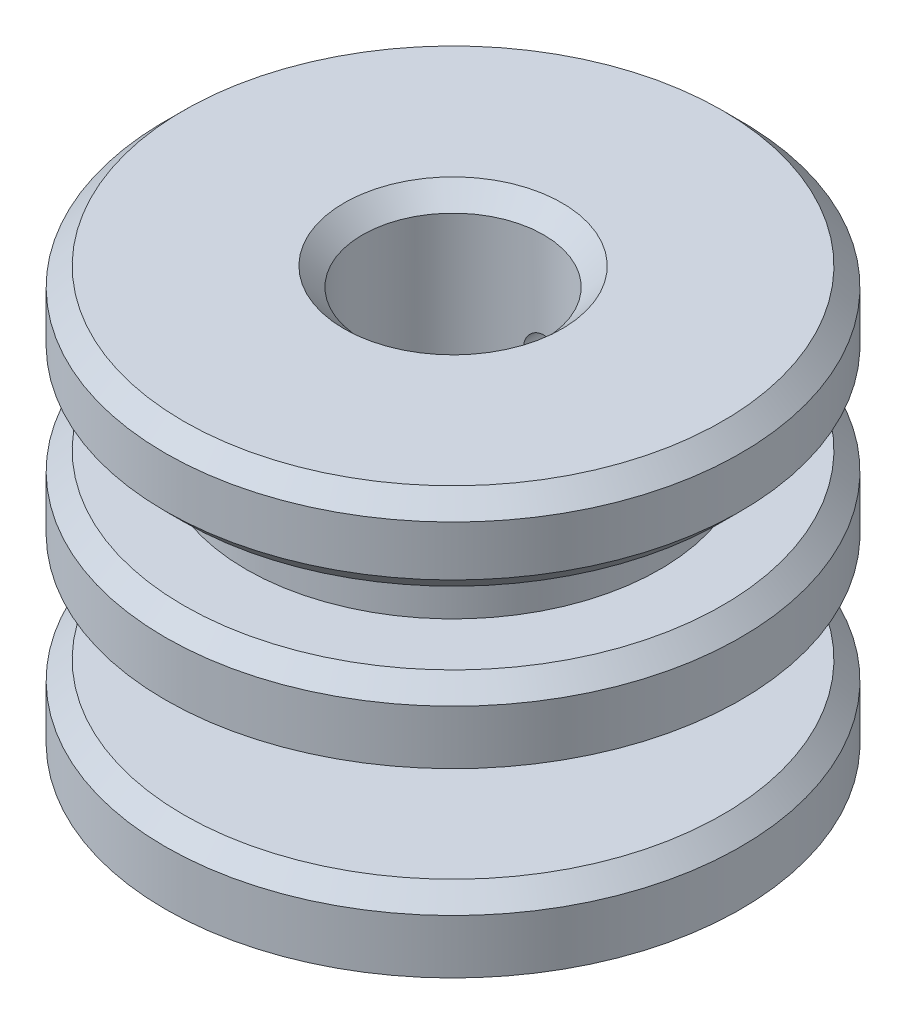
ISO-10303-21;
HEADER;
FILE_DESCRIPTION(('STEP AP214'),'2;1');
FILE_NAME('part.step','',(''),(''),'','','');
FILE_SCHEMA(('AUTOMOTIVE_DESIGN { 1 0 10303 214 1 1 1 1 }'));
ENDSEC;
DATA;
#1=APPLICATION_CONTEXT('core data for automotive mechanical design processes');
#2=APPLICATION_PROTOCOL_DEFINITION('international standard','automotive_design',2000,#1);
#3=PRODUCT_CONTEXT('',#1,'mechanical');
#4=PRODUCT('Part','Part','',(#3));
#5=PRODUCT_RELATED_PRODUCT_CATEGORY('part','',(#4));
#6=PRODUCT_DEFINITION_FORMATION('','',#4);
#7=PRODUCT_DEFINITION_CONTEXT('part definition',#1,'design');
#8=PRODUCT_DEFINITION('design','',#6,#7);
#9=PRODUCT_DEFINITION_SHAPE('','',#8);
#10=(LENGTH_UNIT() NAMED_UNIT(*) SI_UNIT(.MILLI.,.METRE.));
#11=(NAMED_UNIT(*) PLANE_ANGLE_UNIT() SI_UNIT($,.RADIAN.));
#12=(NAMED_UNIT(*) SI_UNIT($,.STERADIAN.) SOLID_ANGLE_UNIT());
#13=UNCERTAINTY_MEASURE_WITH_UNIT(LENGTH_MEASURE(1.E-05),#10,'distance_accuracy_value','');
#14=(GEOMETRIC_REPRESENTATION_CONTEXT(3) GLOBAL_UNCERTAINTY_ASSIGNED_CONTEXT((#13)) GLOBAL_UNIT_ASSIGNED_CONTEXT((#10,
#11,#12)) REPRESENTATION_CONTEXT('',''));
#15=CARTESIAN_POINT('',(0.,0.,0.));
#16=DIRECTION('',(0.,0.,1.));
#17=DIRECTION('',(1.,0.,0.));
#18=AXIS2_PLACEMENT_3D('',#15,#16,#17);
#19=CARTESIAN_POINT('',(0.,3.5,0.));
#20=DIRECTION('',(0.,1.,0.));
#21=DIRECTION('',(0.,0.,1.));
#22=AXIS2_PLACEMENT_3D('',#19,#20,#21);
#23=PLANE('',#22);
#24=CARTESIAN_POINT('',(0.,3.5,0.));
#25=DIRECTION('',(0.,1.,0.));
#26=DIRECTION('',(0.,0.,1.));
#27=AXIS2_PLACEMENT_3D('',#24,#25,#26);
#28=CIRCLE('',#27,1.1375);
#29=CARTESIAN_POINT('',(0.,3.5,1.1375));
#30=VERTEX_POINT('',#29);
#31=EDGE_CURVE('E162',#30,#30,#28,.T.);
#32=ORIENTED_EDGE('',*,*,#31,.F.);
#33=EDGE_LOOP('',(#32));
#34=FACE_BOUND('',#33,.T.);
#35=CARTESIAN_POINT('',(0.,3.5,0.));
#36=DIRECTION('',(0.,1.,0.));
#37=DIRECTION('',(0.,0.,1.));
#38=AXIS2_PLACEMENT_3D('',#35,#36,#37);
#39=CIRCLE('',#38,2.5);
#40=CARTESIAN_POINT('',(0.,3.5,-2.5));
#41=VERTEX_POINT('',#40);
#42=EDGE_CURVE('E192',#41,#41,#39,.F.);
#43=ORIENTED_EDGE('',*,*,#42,.F.);
#44=EDGE_LOOP('',(#43));
#45=FACE_BOUND('',#44,.T.);
#46=ADVANCED_FACE('F39',(#34,#45),#23,.T.);
#47=CARTESIAN_POINT('',(0.,2.,0.));
#48=DIRECTION('',(0.,1.,0.));
#49=DIRECTION('',(0.,0.,1.));
#50=AXIS2_PLACEMENT_3D('',#47,#48,#49);
#51=PLANE('',#50);
#52=CARTESIAN_POINT('',(0.,2.,0.));
#53=DIRECTION('',(0.,1.,0.));
#54=DIRECTION('',(0.,0.,1.));
#55=AXIS2_PLACEMENT_3D('',#52,#53,#54);
#56=CIRCLE('',#55,7.4295);
#57=CARTESIAN_POINT('',(0.,2.,7.4295));
#58=VERTEX_POINT('',#57);
#59=EDGE_CURVE('E81',#58,#58,#56,.T.);
#60=ORIENTED_EDGE('',*,*,#59,.T.);
#61=EDGE_LOOP('',(#60));
#62=FACE_BOUND('',#61,.T.);
#63=CARTESIAN_POINT('',(0.,2.,0.));
#64=DIRECTION('',(0.,1.,0.));
#65=DIRECTION('',(0.,0.,1.));
#66=AXIS2_PLACEMENT_3D('',#63,#64,#65);
#67=CIRCLE('',#66,3.3707324);
#68=CARTESIAN_POINT('',(0.,2.,3.3707324));
#69=VERTEX_POINT('',#68);
#70=EDGE_CURVE('E172',#69,#69,#67,.T.);
#71=ORIENTED_EDGE('',*,*,#70,.F.);
#72=EDGE_LOOP('',(#71));
#73=FACE_BOUND('',#72,.T.);
#74=ADVANCED_FACE('F117',(#62,#73),#51,.T.);
#75=CARTESIAN_POINT('',(0.,0.,0.));
#76=DIRECTION('',(0.,1.,0.));
#77=DIRECTION('',(0.,0.,1.));
#78=AXIS2_PLACEMENT_3D('',#75,#76,#77);
#79=PLANE('',#78);
#80=CARTESIAN_POINT('',(0.,0.,0.));
#81=DIRECTION('',(0.,1.,0.));
#82=DIRECTION('',(0.,0.,1.));
#83=AXIS2_PLACEMENT_3D('',#80,#81,#82);
#84=CIRCLE('',#83,7.9375);
#85=CARTESIAN_POINT('',(0.,0.,7.9375));
#86=VERTEX_POINT('',#85);
#87=EDGE_CURVE('E189',#86,#86,#84,.T.);
#88=ORIENTED_EDGE('',*,*,#87,.F.);
#89=EDGE_LOOP('',(#88));
#90=FACE_BOUND('',#89,.T.);
#91=CARTESIAN_POINT('',(0.,0.,0.));
#92=DIRECTION('',(0.,1.,0.));
#93=DIRECTION('',(0.,0.,1.));
#94=AXIS2_PLACEMENT_3D('',#91,#92,#93);
#95=CIRCLE('',#94,2.38125);
#96=CARTESIAN_POINT('',(0.,0.,2.38125));
#97=VERTEX_POINT('',#96);
#98=EDGE_CURVE('E185',#97,#97,#95,.T.);
#99=ORIENTED_EDGE('',*,*,#98,.T.);
#100=EDGE_LOOP('',(#99));
#101=FACE_BOUND('',#100,.T.);
#102=ADVANCED_FACE('F120',(#90,#101),#79,.F.);
#103=CARTESIAN_POINT('',(0.,2.,0.));
#104=DIRECTION('',(0.,-1.,0.));
#105=DIRECTION('',(0.,0.,-1.));
#106=AXIS2_PLACEMENT_3D('',#103,#104,#105);
#107=CYLINDRICAL_SURFACE('',#106,7.9375);
#108=CARTESIAN_POINT('',(0.,1.492,0.));
#109=DIRECTION('',(0.,1.,0.));
#110=DIRECTION('',(0.,0.,1.));
#111=AXIS2_PLACEMENT_3D('',#108,#109,#110);
#112=CIRCLE('',#111,7.9375);
#113=CARTESIAN_POINT('',(0.,1.492,7.9375));
#114=VERTEX_POINT('',#113);
#115=EDGE_CURVE('E202',#114,#114,#112,.F.);
#116=ORIENTED_EDGE('',*,*,#115,.T.);
#117=EDGE_LOOP('',(#116));
#118=FACE_BOUND('',#117,.T.);
#119=ORIENTED_EDGE('',*,*,#87,.T.);
#120=EDGE_LOOP('',(#119));
#121=FACE_BOUND('',#120,.T.);
#122=ADVANCED_FACE('F115',(#118,#121),#107,.T.);
#123=CARTESIAN_POINT('',(0.,2.,0.));
#124=DIRECTION('',(0.,-1.,0.));
#125=DIRECTION('',(0.,0.,-1.));
#126=AXIS2_PLACEMENT_3D('',#123,#124,#125);
#127=CYLINDRICAL_SURFACE('',#126,2.38125);
#128=CARTESIAN_POINT('',(0.,2.,0.));
#129=DIRECTION('',(0.,1.,0.));
#130=DIRECTION('',(0.,0.,1.));
#131=AXIS2_PLACEMENT_3D('',#128,#129,#130);
#132=CIRCLE('',#131,2.38125);
#133=CARTESIAN_POINT('',(0.,2.,2.38125));
#134=VERTEX_POINT('',#133);
#135=EDGE_CURVE('E181',#134,#134,#132,.T.);
#136=ORIENTED_EDGE('',*,*,#135,.T.);
#137=EDGE_LOOP('',(#136));
#138=FACE_BOUND('',#137,.T.);
#139=ORIENTED_EDGE('',*,*,#98,.F.);
#140=EDGE_LOOP('',(#139));
#141=FACE_BOUND('',#140,.T.);
#142=ADVANCED_FACE('F112',(#138,#141),#127,.F.);
#143=CARTESIAN_POINT('',(0.,2.,0.));
#144=DIRECTION('',(0.,1.,0.));
#145=DIRECTION('',(0.,0.,1.));
#146=AXIS2_PLACEMENT_3D('',#143,#144,#145);
#147=PLANE('',#146);
#148=CARTESIAN_POINT('',(0.,2.,0.));
#149=DIRECTION('',(0.,1.,0.));
#150=DIRECTION('',(0.,0.,1.));
#151=AXIS2_PLACEMENT_3D('',#148,#149,#150);
#152=CIRCLE('',#151,1.1375);
#153=CARTESIAN_POINT('',(0.,2.,1.1375));
#154=VERTEX_POINT('',#153);
#155=EDGE_CURVE('E165',#154,#154,#152,.T.);
#156=ORIENTED_EDGE('',*,*,#155,.T.);
#157=EDGE_LOOP('',(#156));
#158=FACE_BOUND('',#157,.T.);
#159=ORIENTED_EDGE('',*,*,#135,.F.);
#160=EDGE_LOOP('',(#159));
#161=FACE_BOUND('',#160,.T.);
#162=ADVANCED_FACE('F109',(#158,#161),#147,.F.);
#163=CARTESIAN_POINT('',(0.,3.5,0.));
#164=DIRECTION('',(0.,-1.,0.));
#165=DIRECTION('',(0.,0.,-1.));
#166=AXIS2_PLACEMENT_3D('',#163,#164,#165);
#167=CYLINDRICAL_SURFACE('',#166,3.3707324);
#168=CARTESIAN_POINT('',(0.,4.5,-3.3707324));
#169=CARTESIAN_POINT('',(-0.027920858534992,4.49999884581119,-3.37073195597288));
#170=CARTESIAN_POINT('',(-0.0558580082287975,4.4976533822732,-3.37038184613021));
#171=CARTESIAN_POINT('',(-0.110951674200742,4.48833573130278,-3.36901888267828));
#172=CARTESIAN_POINT('',(-0.138107399249805,4.48135901537788,-3.36800538040973));
#173=CARTESIAN_POINT('',(-0.190832907339295,4.46299170098424,-3.36542954720662));
#174=CARTESIAN_POINT('',(-0.216403863038884,4.45160441249328,-3.36386762792149));
#175=CARTESIAN_POINT('',(-0.265268022204005,4.42474722636508,-3.3603676330121));
#176=CARTESIAN_POINT('',(-0.288561546690961,4.40927790526206,-3.35842961051777));
#177=CARTESIAN_POINT('',(-0.332391713755101,4.37456970999245,-3.35437641462116));
#178=CARTESIAN_POINT('',(-0.352908419705849,4.35530578767948,-3.35226012068015));
#179=CARTESIAN_POINT('',(-0.390430567523994,4.31360911727493,-3.34809769069515));
#180=CARTESIAN_POINT('',(-0.407435809182262,4.29117618862251,-3.34605155865703));
#181=CARTESIAN_POINT('',(-0.437529691906431,4.2436446406349,-3.34225024114205));
#182=CARTESIAN_POINT('',(-0.450599085650153,4.2185337093089,-3.34049650360256));
#183=CARTESIAN_POINT('',(-0.472327285075649,4.1664428019623,-3.33749380523005));
#184=CARTESIAN_POINT('',(-0.480986325794444,4.13946292562878,-3.33624481749858));
#185=CARTESIAN_POINT('',(-0.493586195514157,4.08460948142785,-3.33440402998209));
#186=CARTESIAN_POINT('',(-0.497561125654794,4.05674390883326,-3.33380748263638));
#187=CARTESIAN_POINT('',(-0.500785574016822,4.00073536799169,-3.33332469835715));
#188=CARTESIAN_POINT('',(-0.500035357653317,3.97259241541401,-3.33343842152719));
#189=CARTESIAN_POINT('',(-0.493858685873958,3.91706864998727,-3.33435898735029));
#190=CARTESIAN_POINT('',(-0.488470180561042,3.88968350874145,-3.33516020481374));
#191=CARTESIAN_POINT('',(-0.473229283751064,3.83621041627017,-3.33735669596831));
#192=CARTESIAN_POINT('',(-0.463376768528197,3.81012250102124,-3.33875198612485));
#193=CARTESIAN_POINT('',(-0.439447963415574,3.75986876054762,-3.34198563403982));
#194=CARTESIAN_POINT('',(-0.425355568974366,3.73571071645752,-3.34382567578635));
#195=CARTESIAN_POINT('',(-0.393358509658937,3.6900878750967,-3.34774027752663));
#196=CARTESIAN_POINT('',(-0.375453600018527,3.66862325088614,-3.34981485257357));
#197=CARTESIAN_POINT('',(-0.336131306519958,3.62877658274773,-3.35398963365019));
#198=CARTESIAN_POINT('',(-0.31468128837668,3.61042673382278,-3.35608989194537));
#199=CARTESIAN_POINT('',(-0.268988972981071,3.57758248666879,-3.3600605438281));
#200=CARTESIAN_POINT('',(-0.2447466639849,3.56308810465597,-3.36193093644881));
#201=CARTESIAN_POINT('',(-0.194130232363579,3.53836469567626,-3.36523300676029));
#202=CARTESIAN_POINT('',(-0.167754895436238,3.52813811900734,-3.36666443229983));
#203=CARTESIAN_POINT('',(-0.113635239691182,3.51226842964512,-3.36892516636892));
#204=CARTESIAN_POINT('',(-0.0858910114901812,3.50662501399023,-3.36975451469732));
#205=CARTESIAN_POINT('',(-0.030099032282589,3.5001245751329,-3.37071238529574));
#206=CARTESIAN_POINT('',(-0.00205654618325971,3.49922328398923,-3.37084738903507));
#207=CARTESIAN_POINT('',(0.0537791618329003,3.50211522629928,-3.37041899204438));
#208=CARTESIAN_POINT('',(0.0815723912654967,3.505908317722,-3.36985561244432));
#209=CARTESIAN_POINT('',(0.135986799410733,3.51804454453046,-3.36809776078749));
#210=CARTESIAN_POINT('',(0.162612885716383,3.52636614590635,-3.36690627633272));
#211=CARTESIAN_POINT('',(0.214091897523264,3.54730048737677,-3.36402539440444));
#212=CARTESIAN_POINT('',(0.238944741285117,3.55991342513031,-3.36233597399647));
#213=CARTESIAN_POINT('',(0.286366663409767,3.58917649305886,-3.35863089223554));
#214=CARTESIAN_POINT('',(0.308918210899693,3.60585474408651,-3.35661299248112));
#215=CARTESIAN_POINT('',(0.35091801190852,3.64273580755681,-3.35248261044069));
#216=CARTESIAN_POINT('',(0.370366089140317,3.66293882008091,-3.35037012279051));
#217=CARTESIAN_POINT('',(0.405767678097176,3.70649284454076,-3.34626814278441));
#218=CARTESIAN_POINT('',(0.42169153834585,3.72986808120506,-3.34427978815961));
#219=CARTESIAN_POINT('',(0.449386660171263,3.7789875692684,-3.34067125298515));
#220=CARTESIAN_POINT('',(0.461158031987257,3.80473175775419,-3.33905106266197));
#221=CARTESIAN_POINT('',(0.480167926607531,3.8577694278684,-3.33637050349637));
#222=CARTESIAN_POINT('',(0.48742213312231,3.88505718600507,-3.33530819969366));
#223=CARTESIAN_POINT('',(0.497241739005651,3.94048061481776,-3.3338585181474));
#224=CARTESIAN_POINT('',(0.499807454411648,3.96861622821237,-3.33347109491222));
#225=CARTESIAN_POINT('',(0.500169851780815,4.02464119891652,-3.3334167126355));
#226=CARTESIAN_POINT('',(0.498013152556583,4.05253025904644,-3.33374271081059));
#227=CARTESIAN_POINT('',(0.489091758107744,4.10754439648219,-3.33506314529619));
#228=CARTESIAN_POINT('',(0.482327069624303,4.13466947490562,-3.33605758062882));
#229=CARTESIAN_POINT('',(0.464398072745269,4.18737323204891,-3.33860039977759));
#230=CARTESIAN_POINT('',(0.453236950833954,4.21295301532815,-3.34014838231436));
#231=CARTESIAN_POINT('',(0.426836541409066,4.26188448135575,-3.34362437705717));
#232=CARTESIAN_POINT('',(0.411597121962114,4.28523609198931,-3.34555240155709));
#233=CARTESIAN_POINT('',(0.377303068422935,4.32928531369934,-3.3495939112395));
#234=CARTESIAN_POINT('',(0.358213888368723,4.34995588797208,-3.35170897063949));
#235=CARTESIAN_POINT('',(0.316835172516294,4.38781695335703,-3.3558730388943));
#236=CARTESIAN_POINT('',(0.294544893231012,4.40500663375553,-3.35792203226889));
#237=CARTESIAN_POINT('',(0.247255921759422,4.43550029781356,-3.36173566270468));
#238=CARTESIAN_POINT('',(0.222243312560219,4.44878289383489,-3.36349871174772));
#239=CARTESIAN_POINT('',(0.170327989967962,4.47093868089317,-3.36652620856215));
#240=CARTESIAN_POINT('',(0.143427274507468,4.47981645501002,-3.36779117428956));
#241=CARTESIAN_POINT('',(0.0970037631650437,4.49088851747963,-3.36939005661064));
#242=CARTESIAN_POINT('',(0.077768002074295,4.49430012430813,-3.36989085976448));
#243=CARTESIAN_POINT('',(0.0390241449266384,4.49885625532159,-3.37056218465701));
#244=CARTESIAN_POINT('',(0.0195160521454493,4.50000080675202,-3.37073271036497));
#245=CARTESIAN_POINT('',(0.,4.5,-3.3707324));
#246=B_SPLINE_CURVE_WITH_KNOTS('',3,(#168,#169,#170,#171,#172,#173,#174,#175,#176,#177,#178,
#179,#180,#181,#182,#183,#184,#185,#186,#187,#188,#189,#190,#191,#192,#193,#194,#195,#196,#197,
#198,#199,#200,#201,#202,#203,#204,#205,#206,#207,#208,#209,#210,#211,#212,#213,#214,#215,#216,
#217,#218,#219,#220,#221,#222,#223,#224,#225,#226,#227,#228,#229,#230,#231,#232,#233,#234,#235,
#236,#237,#238,#239,#240,#241,#242,#243,#244,#245),.UNSPECIFIED.,.T.,.F.,(4,2,2,2,2,2,2,2,2,2,2,
2,2,2,2,2,2,2,2,2,2,2,2,2,2,2,2,2,2,2,2,2,2,2,2,2,2,2,4),(0.,0.0836912638754877,
0.16746448282372,0.251174954384891,0.334873609248749,0.419144484030289,0.503420162261685,
0.588101517115428,0.672778358648735,0.7568348529606,0.840886625796777,0.924257160754208,
1.00763000657514,1.09132361791786,1.17502260407095,1.25954003034908,1.34405781210426,
1.42862405196998,1.51318470128194,1.59695455436652,1.68072187301216,1.76409429766159,
1.84747056296623,1.93144080116889,2.01541580745489,2.1000725432916,2.18472703151263,
2.26908593398137,2.35343914985412,2.43696340357937,2.52048753511476,2.60395124038317,
2.68741764603817,2.7716693336959,2.85594062138737,2.94066497899636,3.02530099771829,
3.0838000119048,3.14229832304612),.UNSPECIFIED.);
#247=CARTESIAN_POINT('',(0.,4.5,-3.3707324));
#248=VERTEX_POINT('',#247);
#249=EDGE_CURVE('E57',#248,#248,#246,.T.);
#250=ORIENTED_EDGE('',*,*,#249,.T.);
#251=EDGE_LOOP('',(#250));
#252=FACE_BOUND('',#251,.T.);
#253=ORIENTED_EDGE('',*,*,#70,.T.);
#254=EDGE_LOOP('',(#253));
#255=FACE_BOUND('',#254,.T.);
#256=CARTESIAN_POINT('',(0.,5.,0.));
#257=DIRECTION('',(0.,1.,0.));
#258=DIRECTION('',(0.,0.,1.));
#259=AXIS2_PLACEMENT_3D('',#256,#257,#258);
#260=CIRCLE('',#259,3.3707324);
#261=CARTESIAN_POINT('',(0.,5.,3.3707324));
#262=VERTEX_POINT('',#261);
#263=EDGE_CURVE('E168',#262,#262,#260,.T.);
#264=ORIENTED_EDGE('',*,*,#263,.F.);
#265=EDGE_LOOP('',(#264));
#266=FACE_BOUND('',#265,.T.);
#267=ADVANCED_FACE('F103',(#252,#255,#266),#167,.T.);
#268=CARTESIAN_POINT('',(0.,3.5,0.));
#269=DIRECTION('',(0.,-1.,0.));
#270=DIRECTION('',(0.,0.,-1.));
#271=AXIS2_PLACEMENT_3D('',#268,#269,#270);
#272=CYLINDRICAL_SURFACE('',#271,1.1375);
#273=ORIENTED_EDGE('',*,*,#31,.T.);
#274=EDGE_LOOP('',(#273));
#275=FACE_BOUND('',#274,.T.);
#276=ORIENTED_EDGE('',*,*,#155,.F.);
#277=EDGE_LOOP('',(#276));
#278=FACE_BOUND('',#277,.T.);
#279=ADVANCED_FACE('F108',(#275,#278),#272,.F.);
#280=CARTESIAN_POINT('',(0.,5.,0.));
#281=DIRECTION('',(0.,-1.,0.));
#282=DIRECTION('',(0.,0.,-1.));
#283=AXIS2_PLACEMENT_3D('',#280,#281,#282);
#284=CYLINDRICAL_SURFACE('',#283,2.5);
#285=CARTESIAN_POINT('',(0.,10.892,0.));
#286=DIRECTION('',(0.,1.,0.));
#287=DIRECTION('',(0.,0.,1.));
#288=AXIS2_PLACEMENT_3D('',#285,#286,#287);
#289=CIRCLE('',#288,2.5);
#290=CARTESIAN_POINT('',(0.,10.892,2.5));
#291=VERTEX_POINT('',#290);
#292=EDGE_CURVE('E11',#291,#291,#289,.T.);
#293=ORIENTED_EDGE('',*,*,#292,.T.);
#294=EDGE_LOOP('',(#293));
#295=FACE_BOUND('',#294,.T.);
#296=CARTESIAN_POINT('',(0.,8.5,-2.5));
#297=CARTESIAN_POINT('',(-0.0277884533963166,8.49999897775083,-2.49999948790436));
#298=CARTESIAN_POINT('',(-0.0555898301007612,8.49767557851618,-2.49953192589115));
#299=CARTESIAN_POINT('',(-0.11040675384451,8.48845074994238,-2.49771182811616));
#300=CARTESIAN_POINT('',(-0.137421658770678,8.48154568359925,-2.49635858930093));
#301=CARTESIAN_POINT('',(-0.189865152631656,8.4633793631896,-2.49291824639143));
#302=CARTESIAN_POINT('',(-0.215295233966567,8.45212228157766,-2.49083184538359));
#303=CARTESIAN_POINT('',(-0.263903994432113,8.42558387624435,-2.48615199017657));
#304=CARTESIAN_POINT('',(-0.287082807537906,8.4103027921964,-2.48355856617854));
#305=CARTESIAN_POINT('',(-0.330846738657433,8.37593075285428,-2.47811082664985));
#306=CARTESIAN_POINT('',(-0.351396975579263,8.3567958223044,-2.47525372752174));
#307=CARTESIAN_POINT('',(-0.389018378304015,8.31535379180415,-2.46962090226294));
#308=CARTESIAN_POINT('',(-0.406089272385213,8.29304644433244,-2.46684518250212));
#309=CARTESIAN_POINT('',(-0.436415876673811,8.24564190349406,-2.46166220906308));
#310=CARTESIAN_POINT('',(-0.449635469432934,8.22052117810182,-2.45925853682473));
#311=CARTESIAN_POINT('',(-0.471652833290155,8.16835909049796,-2.45513134029209));
#312=CARTESIAN_POINT('',(-0.48045104121862,8.14131791832683,-2.45340774880981));
#313=CARTESIAN_POINT('',(-0.493262649942414,8.08645781804604,-2.45086402626102));
#314=CARTESIAN_POINT('',(-0.497337248979389,8.05865372792889,-2.45003235053594));
#315=CARTESIAN_POINT('',(-0.50077606386306,8.00274508931783,-2.44933187530314));
#316=CARTESIAN_POINT('',(-0.500140761356751,7.97464057183993,-2.4494629773392));
#317=CARTESIAN_POINT('',(-0.49422728655091,7.9193766059895,-2.45066275574092));
#318=CARTESIAN_POINT('',(-0.489019270121953,7.89220929718634,-2.45171726429382));
#319=CARTESIAN_POINT('',(-0.474218942311526,7.8391419616685,-2.45462273080001));
#320=CARTESIAN_POINT('',(-0.464626421550341,7.8132419955405,-2.45647372678889));
#321=CARTESIAN_POINT('',(-0.44126239183736,7.7632423691482,-2.46077809250204));
#322=CARTESIAN_POINT('',(-0.427463075616058,7.73915606021541,-2.46323544906852));
#323=CARTESIAN_POINT('',(-0.39609678728634,7.69361457501359,-2.46847309386531));
#324=CARTESIAN_POINT('',(-0.378529382178415,7.67215970157442,-2.47125341919183));
#325=CARTESIAN_POINT('',(-0.339749967280292,7.63208529877153,-2.47688510620731));
#326=CARTESIAN_POINT('',(-0.318478080606222,7.61352371607043,-2.47973684605452));
#327=CARTESIAN_POINT('',(-0.273092512031005,7.58022307684939,-2.48514424357204));
#328=CARTESIAN_POINT('',(-0.248978793689695,7.56548406935321,-2.48769989744487));
#329=CARTESIAN_POINT('',(-0.198529693439461,7.54023624538701,-2.49223345080444));
#330=CARTESIAN_POINT('',(-0.17219090979265,7.52973405317773,-2.49421044424136));
#331=CARTESIAN_POINT('',(-0.118074488224332,7.51331976298072,-2.49735704493929));
#332=CARTESIAN_POINT('',(-0.0902970250362247,7.50740710896319,-2.49852675000266));
#333=CARTESIAN_POINT('',(-0.034589702813575,7.50042177310286,-2.49991335933434));
#334=CARTESIAN_POINT('',(-0.00667016416278788,7.49926979022987,-2.50014587326235));
#335=CARTESIAN_POINT('',(0.0489624670963572,7.50162492947109,-2.49967525965051));
#336=CARTESIAN_POINT('',(0.0766755712218968,7.5051317896763,-2.49897218470723));
#337=CARTESIAN_POINT('',(0.130852829973271,7.51663918677198,-2.49671916004009));
#338=CARTESIAN_POINT('',(0.157325974169952,7.52459903424895,-2.49517688202103));
#339=CARTESIAN_POINT('',(0.208561813749834,7.5447419913279,-2.49141776030516));
#340=CARTESIAN_POINT('',(0.23332438081877,7.55692541733842,-2.48920086607113));
#341=CARTESIAN_POINT('',(0.280770586843109,7.58534124532566,-2.48429955766647));
#342=CARTESIAN_POINT('',(0.303425063376095,7.60162139051947,-2.48160975218526));
#343=CARTESIAN_POINT('',(0.345709009559604,7.63770459560364,-2.47607367414941));
#344=CARTESIAN_POINT('',(0.365338154465382,7.65750803319993,-2.47322738484194));
#345=CARTESIAN_POINT('',(0.401320295387089,7.70043667594556,-2.46764651778482));
#346=CARTESIAN_POINT('',(0.417618851224329,7.72360787211067,-2.46491430116652));
#347=CARTESIAN_POINT('',(0.446092710025604,7.77240568067834,-2.45992095898097));
#348=CARTESIAN_POINT('',(0.458268177961452,7.79803219478678,-2.45765981456671));
#349=CARTESIAN_POINT('',(0.478075920790981,7.85088412307478,-2.45388370292191));
#350=CARTESIAN_POINT('',(0.485731749895526,7.87810042060516,-2.45236487436093));
#351=CARTESIAN_POINT('',(0.496354325813599,7.93346672674545,-2.45023718396013));
#352=CARTESIAN_POINT('',(0.499321684112557,7.96161661310468,-2.44962820345556));
#353=CARTESIAN_POINT('',(0.500460455433734,8.01750443227216,-2.4493957481569));
#354=CARTESIAN_POINT('',(0.498717894035448,8.04524057446351,-2.4497545959465));
#355=CARTESIAN_POINT('',(0.49067615205003,8.10001582495252,-2.45137786742307));
#356=CARTESIAN_POINT('',(0.484377008064649,8.1270549388474,-2.45264228383585));
#357=CARTESIAN_POINT('',(0.467439284249477,8.17961385562027,-2.45592632109579));
#358=CARTESIAN_POINT('',(0.456811253358672,8.20513718025121,-2.45794410509415));
#359=CARTESIAN_POINT('',(0.431527322300801,8.25405186036722,-2.46250857487085));
#360=CARTESIAN_POINT('',(0.416871084387441,8.27744303686257,-2.46505530499447));
#361=CARTESIAN_POINT('',(0.383652957393207,8.32185778607516,-2.47044480261613));
#362=CARTESIAN_POINT('',(0.36502894361759,8.3428343826338,-2.4732918645485));
#363=CARTESIAN_POINT('',(0.32453218450657,8.38139310276459,-2.47893040935977));
#364=CARTESIAN_POINT('',(0.302658693576667,8.39897444515864,-2.48172187931592));
#365=CARTESIAN_POINT('',(0.256008814544123,8.43041732197323,-2.48696916193986));
#366=CARTESIAN_POINT('',(0.231204442214917,8.44423800164001,-2.48942115609623));
#367=CARTESIAN_POINT('',(0.179583180470366,8.4674930612983,-2.493675625425));
#368=CARTESIAN_POINT('',(0.152768130431563,8.47693139476625,-2.49547868569308));
#369=CARTESIAN_POINT('',(0.10491074446189,8.48932597402236,-2.49788186297685));
#370=CARTESIAN_POINT('',(0.0841408320068922,8.49332159685388,-2.49867151579226));
#371=CARTESIAN_POINT('',(0.0422497626050334,8.49865895617918,-2.49973077069946));
#372=CARTESIAN_POINT('',(0.0211286168743095,8.50000077725488,-2.50000038936577));
#373=CARTESIAN_POINT('',(0.,8.5,-2.5));
#374=B_SPLINE_CURVE_WITH_KNOTS('',3,(#296,#297,#298,#299,#300,#301,#302,#303,#304,#305,#306,
#307,#308,#309,#310,#311,#312,#313,#314,#315,#316,#317,#318,#319,#320,#321,#322,#323,#324,#325,
#326,#327,#328,#329,#330,#331,#332,#333,#334,#335,#336,#337,#338,#339,#340,#341,#342,#343,#344,
#345,#346,#347,#348,#349,#350,#351,#352,#353,#354,#355,#356,#357,#358,#359,#360,#361,#362,#363,
#364,#365,#366,#367,#368,#369,#370,#371,#372,#373),.UNSPECIFIED.,.T.,.F.,(4,2,2,2,2,2,2,2,2,2,2,
2,2,2,2,2,2,2,2,2,2,2,2,2,2,2,2,2,2,2,2,2,2,2,2,2,2,2,4),(0.,0.0832880653306292,
0.166642325345662,0.249916867625171,0.333186451115432,0.417466335056093,0.501752798373684,
0.586805975029615,0.671850746825989,0.755780925517938,0.839702521406128,0.922358635031393,
1.00501869626865,1.08823745101796,1.17146577374835,1.25619126245676,1.3409178376991,
1.42577637427012,1.51062462849018,1.59405367838133,1.67747803828934,1.76015226975362,
1.84283269608011,1.9265253301668,2.01022694172965,2.09520314289613,2.18017594361734,
2.26470190516362,2.34921684165208,2.43219861283851,2.51517971746305,2.59795980626556,
2.68074683790934,2.76494038119572,2.84915327266466,2.93424748337819,3.0192647775876,
3.08259387644947,3.14592095685498),.UNSPECIFIED.);
#375=CARTESIAN_POINT('',(0.,8.5,-2.5));
#376=VERTEX_POINT('',#375);
#377=EDGE_CURVE('E58',#376,#376,#374,.T.);
#378=ORIENTED_EDGE('',*,*,#377,.F.);
#379=EDGE_LOOP('',(#378));
#380=FACE_BOUND('',#379,.T.);
#381=ORIENTED_EDGE('',*,*,#42,.T.);
#382=CARTESIAN_POINT('',(0.,4.5,-2.5));
#383=CARTESIAN_POINT('',(-0.0277884533963166,4.49999897775083,-2.49999948790436));
#384=CARTESIAN_POINT('',(-0.0555898301007611,4.49767557851618,-2.49953192589115));
#385=CARTESIAN_POINT('',(-0.11040675384451,4.48845074994238,-2.49771182811616));
#386=CARTESIAN_POINT('',(-0.137421658770678,4.48154568359925,-2.49635858930093));
#387=CARTESIAN_POINT('',(-0.189865152631657,4.46337936318961,-2.49291824639143));
#388=CARTESIAN_POINT('',(-0.215295233966567,4.45212228157766,-2.49083184538359));
#389=CARTESIAN_POINT('',(-0.263903994432113,4.42558387624435,-2.48615199017657));
#390=CARTESIAN_POINT('',(-0.287082807537906,4.4103027921964,-2.48355856617854));
#391=CARTESIAN_POINT('',(-0.330846738657432,4.37593075285428,-2.47811082664985));
#392=CARTESIAN_POINT('',(-0.351396975579262,4.3567958223044,-2.47525372752174));
#393=CARTESIAN_POINT('',(-0.389018378304014,4.31535379180415,-2.46962090226294));
#394=CARTESIAN_POINT('',(-0.406089272385212,4.29304644433244,-2.46684518250212));
#395=CARTESIAN_POINT('',(-0.43641587667381,4.24564190349406,-2.46166220906308));
#396=CARTESIAN_POINT('',(-0.449635469432933,4.22052117810182,-2.45925853682473));
#397=CARTESIAN_POINT('',(-0.471652833290154,4.16835909049796,-2.45513134029209));
#398=CARTESIAN_POINT('',(-0.480451041218619,4.14131791832683,-2.45340774880981));
#399=CARTESIAN_POINT('',(-0.493262649942414,4.08645781804604,-2.45086402626102));
#400=CARTESIAN_POINT('',(-0.497337248979389,4.05865372792889,-2.45003235053594));
#401=CARTESIAN_POINT('',(-0.50077606386306,4.00274508931783,-2.44933187530314));
#402=CARTESIAN_POINT('',(-0.50014076135675,3.97464057183993,-2.4494629773392));
#403=CARTESIAN_POINT('',(-0.494227286550909,3.9193766059895,-2.45066275574092));
#404=CARTESIAN_POINT('',(-0.489019270121953,3.89220929718634,-2.45171726429382));
#405=CARTESIAN_POINT('',(-0.474218942311525,3.8391419616685,-2.45462273080001));
#406=CARTESIAN_POINT('',(-0.46462642155034,3.8132419955405,-2.45647372678889));
#407=CARTESIAN_POINT('',(-0.44126239183736,3.7632423691482,-2.46077809250204));
#408=CARTESIAN_POINT('',(-0.427463075616057,3.73915606021541,-2.46323544906852));
#409=CARTESIAN_POINT('',(-0.396096787286339,3.69361457501359,-2.46847309386531));
#410=CARTESIAN_POINT('',(-0.378529382178414,3.67215970157442,-2.47125341919183));
#411=CARTESIAN_POINT('',(-0.339749967280292,3.63208529877153,-2.47688510620731));
#412=CARTESIAN_POINT('',(-0.318478080606222,3.61352371607043,-2.47973684605452));
#413=CARTESIAN_POINT('',(-0.273092512031005,3.58022307684939,-2.48514424357204));
#414=CARTESIAN_POINT('',(-0.248978793689694,3.56548406935321,-2.48769989744487));
#415=CARTESIAN_POINT('',(-0.19852969343946,3.54023624538701,-2.49223345080444));
#416=CARTESIAN_POINT('',(-0.17219090979265,3.52973405317773,-2.49421044424136));
#417=CARTESIAN_POINT('',(-0.118074488224332,3.51331976298072,-2.49735704493929));
#418=CARTESIAN_POINT('',(-0.0902970250362245,3.50740710896319,-2.49852675000266));
#419=CARTESIAN_POINT('',(-0.0345897028135748,3.50042177310286,-2.49991335933434));
#420=CARTESIAN_POINT('',(-0.00667016416278772,3.49926979022987,-2.50014587326235));
#421=CARTESIAN_POINT('',(0.0489624670963573,3.50162492947109,-2.49967525965051));
#422=CARTESIAN_POINT('',(0.0766755712218968,3.5051317896763,-2.49897218470723));
#423=CARTESIAN_POINT('',(0.130852829973271,3.51663918677198,-2.49671916004009));
#424=CARTESIAN_POINT('',(0.157325974169952,3.52459903424895,-2.49517688202103));
#425=CARTESIAN_POINT('',(0.208561813749834,3.5447419913279,-2.49141776030516));
#426=CARTESIAN_POINT('',(0.23332438081877,3.55692541733842,-2.48920086607113));
#427=CARTESIAN_POINT('',(0.280770586843109,3.58534124532566,-2.48429955766647));
#428=CARTESIAN_POINT('',(0.303425063376094,3.60162139051947,-2.48160975218526));
#429=CARTESIAN_POINT('',(0.345709009559603,3.63770459560364,-2.47607367414941));
#430=CARTESIAN_POINT('',(0.365338154465381,3.65750803319993,-2.47322738484194));
#431=CARTESIAN_POINT('',(0.401320295387088,3.70043667594556,-2.46764651778483));
#432=CARTESIAN_POINT('',(0.417618851224327,3.72360787211067,-2.46491430116652));
#433=CARTESIAN_POINT('',(0.446092710025603,3.77240568067834,-2.45992095898097));
#434=CARTESIAN_POINT('',(0.458268177961451,3.79803219478678,-2.45765981456671));
#435=CARTESIAN_POINT('',(0.47807592079098,3.85088412307477,-2.45388370292191));
#436=CARTESIAN_POINT('',(0.485731749895525,3.87810042060516,-2.45236487436093));
#437=CARTESIAN_POINT('',(0.496354325813598,3.93346672674545,-2.45023718396013));
#438=CARTESIAN_POINT('',(0.499321684112556,3.96161661310467,-2.44962820345556));
#439=CARTESIAN_POINT('',(0.500460455433734,4.01750443227216,-2.4493957481569));
#440=CARTESIAN_POINT('',(0.498717894035448,4.0452405744635,-2.4497545959465));
#441=CARTESIAN_POINT('',(0.490676152050031,4.10001582495251,-2.45137786742307));
#442=CARTESIAN_POINT('',(0.484377008064649,4.1270549388474,-2.45264228383585));
#443=CARTESIAN_POINT('',(0.467439284249477,4.17961385562027,-2.45592632109579));
#444=CARTESIAN_POINT('',(0.456811253358672,4.20513718025121,-2.45794410509415));
#445=CARTESIAN_POINT('',(0.431527322300802,4.25405186036722,-2.46250857487085));
#446=CARTESIAN_POINT('',(0.416871084387441,4.27744303686257,-2.46505530499447));
#447=CARTESIAN_POINT('',(0.383652957393207,4.32185778607516,-2.47044480261613));
#448=CARTESIAN_POINT('',(0.36502894361759,4.3428343826338,-2.4732918645485));
#449=CARTESIAN_POINT('',(0.324532184506571,4.38139310276459,-2.47893040935977));
#450=CARTESIAN_POINT('',(0.302658693576668,4.39897444515864,-2.48172187931592));
#451=CARTESIAN_POINT('',(0.256008814544123,4.43041732197322,-2.48696916193986));
#452=CARTESIAN_POINT('',(0.231204442214918,4.44423800164001,-2.48942115609623));
#453=CARTESIAN_POINT('',(0.179583180470367,4.4674930612983,-2.493675625425));
#454=CARTESIAN_POINT('',(0.152768130431563,4.47693139476625,-2.49547868569308));
#455=CARTESIAN_POINT('',(0.10491074446189,4.48932597402236,-2.49788186297685));
#456=CARTESIAN_POINT('',(0.0841408320068926,4.49332159685388,-2.49867151579226));
#457=CARTESIAN_POINT('',(0.0422497626050337,4.49865895617918,-2.49973077069946));
#458=CARTESIAN_POINT('',(0.0211286168743096,4.50000077725488,-2.50000038936577));
#459=CARTESIAN_POINT('',(0.,4.5,-2.5));
#460=B_SPLINE_CURVE_WITH_KNOTS('',3,(#382,#383,#384,#385,#386,#387,#388,#389,#390,#391,#392,
#393,#394,#395,#396,#397,#398,#399,#400,#401,#402,#403,#404,#405,#406,#407,#408,#409,#410,#411,
#412,#413,#414,#415,#416,#417,#418,#419,#420,#421,#422,#423,#424,#425,#426,#427,#428,#429,#430,
#431,#432,#433,#434,#435,#436,#437,#438,#439,#440,#441,#442,#443,#444,#445,#446,#447,#448,#449,
#450,#451,#452,#453,#454,#455,#456,#457,#458,#459),.UNSPECIFIED.,.T.,.F.,(4,2,2,2,2,2,2,2,2,2,2,
2,2,2,2,2,2,2,2,2,2,2,2,2,2,2,2,2,2,2,2,2,2,2,2,2,2,2,4),(0.,0.0832880653306292,
0.166642325345662,0.249916867625171,0.333186451115432,0.417466335056093,0.501752798373683,
0.586805975029613,0.671850746825988,0.755780925517937,0.839702521406126,0.922358635031392,
1.00501869626865,1.08823745101796,1.17146577374835,1.25619126245675,1.3409178376991,
1.42577637427012,1.51062462849018,1.59405367838133,1.67747803828934,1.76015226975362,
1.84283269608011,1.92652533016679,2.01022694172965,2.09520314289613,2.18017594361733,
2.26470190516362,2.34921684165207,2.43219861283851,2.51517971746304,2.59795980626555,
2.68074683790933,2.76494038119572,2.84915327266465,2.93424748337819,3.01926477758759,
3.08259387644947,3.14592095685498),.UNSPECIFIED.);
#461=EDGE_CURVE('E51',#41,#41,#460,.T.);
#462=ORIENTED_EDGE('',*,*,#461,.F.);
#463=EDGE_LOOP('',(#381,#462));
#464=FACE_BOUND('',#463,.T.);
#465=ADVANCED_FACE('F83',(#295,#380,#464),#284,.F.);
#466=CARTESIAN_POINT('',(0.,7.,0.));
#467=DIRECTION('',(0.,1.,0.));
#468=DIRECTION('',(0.,0.,1.));
#469=AXIS2_PLACEMENT_3D('',#466,#467,#468);
#470=PLANE('',#469);
#471=CARTESIAN_POINT('',(0.,7.,0.));
#472=DIRECTION('',(0.,1.,0.));
#473=DIRECTION('',(0.,0.,1.));
#474=AXIS2_PLACEMENT_3D('',#471,#472,#473);
#475=CIRCLE('',#474,7.4295);
#476=CARTESIAN_POINT('',(0.,7.,7.4295));
#477=VERTEX_POINT('',#476);
#478=EDGE_CURVE('E413',#477,#477,#475,.T.);
#479=ORIENTED_EDGE('',*,*,#478,.T.);
#480=EDGE_LOOP('',(#479));
#481=FACE_BOUND('',#480,.T.);
#482=CARTESIAN_POINT('',(0.,7.,0.));
#483=DIRECTION('',(0.,1.,0.));
#484=DIRECTION('',(0.,0.,1.));
#485=AXIS2_PLACEMENT_3D('',#482,#483,#484);
#486=CIRCLE('',#485,5.7060338);
#487=CARTESIAN_POINT('',(0.,7.,5.7060338));
#488=VERTEX_POINT('',#487);
#489=EDGE_CURVE('E194',#488,#488,#486,.T.);
#490=ORIENTED_EDGE('',*,*,#489,.F.);
#491=EDGE_LOOP('',(#490));
#492=FACE_BOUND('',#491,.T.);
#493=ADVANCED_FACE('F158',(#481,#492),#470,.T.);
#494=CARTESIAN_POINT('',(0.,5.,0.));
#495=DIRECTION('',(0.,1.,0.));
#496=DIRECTION('',(0.,0.,1.));
#497=AXIS2_PLACEMENT_3D('',#494,#495,#496);
#498=PLANE('',#497);
#499=ORIENTED_EDGE('',*,*,#263,.T.);
#500=EDGE_LOOP('',(#499));
#501=FACE_BOUND('',#500,.T.);
#502=CARTESIAN_POINT('',(0.,5.,0.));
#503=DIRECTION('',(0.,1.,0.));
#504=DIRECTION('',(0.,0.,1.));
#505=AXIS2_PLACEMENT_3D('',#502,#503,#504);
#506=CIRCLE('',#505,7.9375);
#507=CARTESIAN_POINT('',(0.,5.,7.9375));
#508=VERTEX_POINT('',#507);
#509=EDGE_CURVE('E175',#508,#508,#506,.T.);
#510=ORIENTED_EDGE('',*,*,#509,.F.);
#511=EDGE_LOOP('',(#510));
#512=FACE_BOUND('',#511,.T.);
#513=ADVANCED_FACE('F224',(#501,#512),#498,.F.);
#514=CARTESIAN_POINT('',(0.,7.,0.));
#515=DIRECTION('',(0.,-1.,0.));
#516=DIRECTION('',(0.,0.,-1.));
#517=AXIS2_PLACEMENT_3D('',#514,#515,#516);
#518=CYLINDRICAL_SURFACE('',#517,7.9375);
#519=CARTESIAN_POINT('',(0.,6.492,0.));
#520=DIRECTION('',(0.,1.,0.));
#521=DIRECTION('',(0.,0.,1.));
#522=AXIS2_PLACEMENT_3D('',#519,#520,#521);
#523=CIRCLE('',#522,7.9375);
#524=CARTESIAN_POINT('',(0.,6.492,7.9375));
#525=VERTEX_POINT('',#524);
#526=EDGE_CURVE('E406',#525,#525,#523,.F.);
#527=ORIENTED_EDGE('',*,*,#526,.T.);
#528=EDGE_LOOP('',(#527));
#529=FACE_BOUND('',#528,.T.);
#530=ORIENTED_EDGE('',*,*,#509,.T.);
#531=EDGE_LOOP('',(#530));
#532=FACE_BOUND('',#531,.T.);
#533=ADVANCED_FACE('F217',(#529,#532),#518,.T.);
#534=CARTESIAN_POINT('',(0.,9.,0.));
#535=DIRECTION('',(0.,-1.,0.));
#536=DIRECTION('',(0.,0.,-1.));
#537=AXIS2_PLACEMENT_3D('',#534,#535,#536);
#538=CYLINDRICAL_SURFACE('',#537,5.7060338);
#539=CARTESIAN_POINT('',(0.,8.5,-5.7060338));
#540=CARTESIAN_POINT('',(-0.0280275469677818,8.49999877821465,-5.70603351405306));
#541=CARTESIAN_POINT('',(-0.0560740419941658,8.49763544104592,-5.70582509694392));
#542=CARTESIAN_POINT('',(-0.111390665384979,8.48824263185756,-5.70501371901142));
#543=CARTESIAN_POINT('',(-0.138659883937116,8.48120790841146,-5.70441031416607));
#544=CARTESIAN_POINT('',(-0.191612818965445,8.46267764733178,-5.70287713065511));
#545=CARTESIAN_POINT('',(-0.217297437299717,8.45118467472139,-5.70194753968776));
#546=CARTESIAN_POINT('',(-0.266366989681593,8.42406884400579,-5.6998661593995));
#547=CARTESIAN_POINT('',(-0.289752405881906,8.4084468543187,-5.69871441681545));
#548=CARTESIAN_POINT('',(-0.333631254655816,8.37346926419793,-5.69631431179807));
#549=CARTESIAN_POINT('',(-0.354117353516539,8.35410447890112,-5.69506571629439));
#550=CARTESIAN_POINT('',(-0.391553089349928,8.31221045462398,-5.69261457859265));
#551=CARTESIAN_POINT('',(-0.408502569041471,8.28968107498179,-5.69141203844472));
#552=CARTESIAN_POINT('',(-0.43840907421564,8.24205257119235,-5.6891866970725));
#553=CARTESIAN_POINT('',(-0.451359602079713,8.21694935221637,-5.68816418951699));
#554=CARTESIAN_POINT('',(-0.472859085188524,8.16491425969971,-5.68641741711878));
#555=CARTESIAN_POINT('',(-0.481408125589103,8.13798242154885,-5.68569314650612));
#556=CARTESIAN_POINT('',(-0.493840556478209,8.0831284407747,-5.68462685396957));
#557=CARTESIAN_POINT('',(-0.49773595608182,8.05520903940635,-5.68428384831909));
#558=CARTESIAN_POINT('',(-0.500787634509626,7.99911074551193,-5.68401582874186));
#559=CARTESIAN_POINT('',(-0.499944010817169,7.97093185833547,-5.68409080621705));
#560=CARTESIAN_POINT('',(-0.493551508394629,7.9151969020204,-5.68464938616077));
#561=CARTESIAN_POINT('',(-0.488015695685385,7.88763932131497,-5.68513185390552));
#562=CARTESIAN_POINT('',(-0.47241626350094,7.83384595416575,-5.68644927449933));
#563=CARTESIAN_POINT('',(-0.462352595711825,7.80761018182947,-5.68728423110957));
#564=CARTESIAN_POINT('',(-0.437968544429137,7.75716361704912,-5.68921385704563));
#565=CARTESIAN_POINT('',(-0.423642314481721,7.73295566475149,-5.69030888265847));
#566=CARTESIAN_POINT('',(-0.391144019227043,7.68728297882406,-5.6926349429974));
#567=CARTESIAN_POINT('',(-0.372971867687393,7.66581830672079,-5.69386598077282));
#568=CARTESIAN_POINT('',(-0.333224359959347,7.62616552335548,-5.69633040880465));
#569=CARTESIAN_POINT('',(-0.311637710805866,7.60798872973202,-5.69756379295269));
#570=CARTESIAN_POINT('',(-0.265713327227982,7.57551523299575,-5.69988998787983));
#571=CARTESIAN_POINT('',(-0.241375590699541,7.56121853285048,-5.70098279855141));
#572=CARTESIAN_POINT('',(-0.190632418379374,7.53691169822646,-5.70290495900251));
#573=CARTESIAN_POINT('',(-0.164226732797404,7.52690208253777,-5.703734276893));
#574=CARTESIAN_POINT('',(-0.110100676323881,7.51146156592038,-5.70503565591296));
#575=CARTESIAN_POINT('',(-0.0823803356191217,7.50603055991247,-5.70550772524127));
#576=CARTESIAN_POINT('',(-0.0265099257296422,7.49991565907073,-5.7060403655125));
#577=CARTESIAN_POINT('',(0.0016384205334685,7.49921613528743,-5.70610229122056));
#578=CARTESIAN_POINT('',(0.0576519773867741,7.50254308778812,-5.7058112887049));
#579=CARTESIAN_POINT('',(0.0855171908985331,7.50656951525634,-5.70545836476628));
#580=CARTESIAN_POINT('',(0.140128796335907,7.51922111797086,-5.70437821582588));
#581=CARTESIAN_POINT('',(0.16687688328004,7.52783903126616,-5.70365158195117));
#582=CARTESIAN_POINT('',(0.218547504642622,7.54942154658061,-5.701905613923));
#583=CARTESIAN_POINT('',(0.243470007250056,7.56238622432069,-5.70088627467065));
#584=CARTESIAN_POINT('',(0.290853015463429,7.5923334004929,-5.69866572628295));
#585=CARTESIAN_POINT('',(0.313306968003155,7.6093262323087,-5.69746405230788));
#586=CARTESIAN_POINT('',(0.355049297314677,7.64683245221367,-5.69501534464865));
#587=CARTESIAN_POINT('',(0.374337613242729,7.66734590795399,-5.69376831009322));
#588=CARTESIAN_POINT('',(0.409254912691235,7.71137898462503,-5.69136540311466));
#589=CARTESIAN_POINT('',(0.424873683200122,7.73490672043487,-5.69020979092168));
#590=CARTESIAN_POINT('',(0.451938461721302,7.78426018740232,-5.68812433013392));
#591=CARTESIAN_POINT('',(0.463384515152941,7.81008589354308,-5.6871944790818));
#592=CARTESIAN_POINT('',(0.481761622775041,7.86326631523637,-5.68566732801943));
#593=CARTESIAN_POINT('',(0.488698886700439,7.89061887127581,-5.68506957079817));
#594=CARTESIAN_POINT('',(0.497881693373802,7.94610602645191,-5.68427278781664));
#595=CARTESIAN_POINT('',(0.500127336837179,7.97424060878762,-5.68407375349694));
#596=CARTESIAN_POINT('',(0.499861938483187,8.03039168117984,-5.6840970913008));
#597=CARTESIAN_POINT('',(0.497366942448334,8.05840824906114,-5.68431804189003));
#598=CARTESIAN_POINT('',(0.487724591937403,8.11362276233392,-5.68515343118264));
#599=CARTESIAN_POINT('',(0.480577230765967,8.14082070654724,-5.68576787045229));
#600=CARTESIAN_POINT('',(0.461837192808538,8.1936266798067,-5.68732062657885));
#601=CARTESIAN_POINT('',(0.450244850684215,8.2192348283796,-5.68825891905238));
#602=CARTESIAN_POINT('',(0.422945669025398,8.26814419895845,-5.6903537039578));
#603=CARTESIAN_POINT('',(0.407238884028788,8.29144545153719,-5.69151019349739));
#604=CARTESIAN_POINT('',(0.372096351703262,8.3351617609544,-5.69391573155793));
#605=CARTESIAN_POINT('',(0.352648697436163,8.35556723029815,-5.69516506759473));
#606=CARTESIAN_POINT('',(0.310598695774986,8.39283299377268,-5.69761289925446));
#607=CARTESIAN_POINT('',(0.287995588100243,8.40969243105482,-5.69881138253384));
#608=CARTESIAN_POINT('',(0.240228324423571,8.43941268770522,-5.70102486216277));
#609=CARTESIAN_POINT('',(0.215059095995319,8.45226537533378,-5.70203948363889));
#610=CARTESIAN_POINT('',(0.162927830059976,8.47354555931625,-5.70376661664652));
#611=CARTESIAN_POINT('',(0.135967883950607,8.48197811904656,-5.70447947367641));
#612=CARTESIAN_POINT('',(0.090708668795687,8.49204183375676,-5.70534068693535));
#613=CARTESIAN_POINT('',(0.0727000677029718,8.49502215301973,-5.70559941419655));
#614=CARTESIAN_POINT('',(0.0364636510768186,8.49900163065055,-5.70594606349774));
#615=CARTESIAN_POINT('',(0.0182358361990005,8.50000079494212,-5.70603398604845));
#616=CARTESIAN_POINT('',(0.,8.5,-5.7060338));
#617=B_SPLINE_CURVE_WITH_KNOTS('',3,(#539,#540,#541,#542,#543,#544,#545,#546,#547,#548,#549,
#550,#551,#552,#553,#554,#555,#556,#557,#558,#559,#560,#561,#562,#563,#564,#565,#566,#567,#568,
#569,#570,#571,#572,#573,#574,#575,#576,#577,#578,#579,#580,#581,#582,#583,#584,#585,#586,#587,
#588,#589,#590,#591,#592,#593,#594,#595,#596,#597,#598,#599,#600,#601,#602,#603,#604,#605,#606,
#607,#608,#609,#610,#611,#612,#613,#614,#615,#616),.UNSPECIFIED.,.T.,.F.,(4,2,2,2,2,2,2,2,2,2,2,
2,2,2,2,2,2,2,2,2,2,2,2,2,2,2,2,2,2,2,2,2,2,2,2,2,2,2,4),(0.,0.0840160578621164,
0.168126724205488,0.252189069655677,0.336233749096673,0.420487355651831,0.504744708349338,
0.589138253191834,0.67353016520601,0.757703823022715,0.841875749364499,0.9258140549751,
1.00975325626018,1.09380812198028,1.17786487255933,1.26220567702684,1.34654654599884,
1.4308976183736,1.51524675483619,1.59931713405241,1.68338664488816,1.76732358335001,
1.85126198407476,1.93541808688734,2.01957580699639,2.10396504977899,2.18835337397099,
2.27262522658061,2.35689527010065,2.44088059032942,2.52486603142424,2.60884515051429,
2.69282315649816,2.7770730193244,2.86134321661308,2.94578334416635,3.03012653069921,
3.08479088117114,3.13945506819473),.UNSPECIFIED.);
#618=CARTESIAN_POINT('',(0.,8.5,-5.7060338));
#619=VERTEX_POINT('',#618);
#620=EDGE_CURVE('E66',#619,#619,#617,.T.);
#621=ORIENTED_EDGE('',*,*,#620,.T.);
#622=EDGE_LOOP('',(#621));
#623=FACE_BOUND('',#622,.T.);
#624=CARTESIAN_POINT('',(0.,9.,0.));
#625=DIRECTION('',(0.,1.,0.));
#626=DIRECTION('',(0.,0.,1.));
#627=AXIS2_PLACEMENT_3D('',#624,#625,#626);
#628=CIRCLE('',#627,5.7060338);
#629=CARTESIAN_POINT('',(0.,9.,5.7060338));
#630=VERTEX_POINT('',#629);
#631=EDGE_CURVE('E63',#630,#630,#628,.T.);
#632=ORIENTED_EDGE('',*,*,#631,.F.);
#633=EDGE_LOOP('',(#632));
#634=FACE_BOUND('',#633,.T.);
#635=ORIENTED_EDGE('',*,*,#489,.T.);
#636=EDGE_LOOP('',(#635));
#637=FACE_BOUND('',#636,.T.);
#638=ADVANCED_FACE('F214',(#623,#634,#637),#538,.T.);
#639=CARTESIAN_POINT('',(0.,11.4,0.));
#640=DIRECTION('',(0.,1.,0.));
#641=DIRECTION('',(0.,0.,1.));
#642=AXIS2_PLACEMENT_3D('',#639,#640,#641);
#643=PLANE('',#642);
#644=CARTESIAN_POINT('',(0.,11.4,0.));
#645=DIRECTION('',(0.,1.,0.));
#646=DIRECTION('',(0.,0.,1.));
#647=AXIS2_PLACEMENT_3D('',#644,#645,#646);
#648=CIRCLE('',#647,7.4295);
#649=CARTESIAN_POINT('',(0.,11.4,7.4295));
#650=VERTEX_POINT('',#649);
#651=EDGE_CURVE('E47',#650,#650,#648,.T.);
#652=ORIENTED_EDGE('',*,*,#651,.T.);
#653=EDGE_LOOP('',(#652));
#654=FACE_BOUND('',#653,.T.);
#655=CARTESIAN_POINT('',(0.,11.4,0.));
#656=DIRECTION('',(0.,1.,0.));
#657=DIRECTION('',(0.,0.,1.));
#658=AXIS2_PLACEMENT_3D('',#655,#656,#657);
#659=CIRCLE('',#658,3.008);
#660=CARTESIAN_POINT('',(0.,11.4,3.008));
#661=VERTEX_POINT('',#660);
#662=EDGE_CURVE('E420',#661,#661,#659,.F.);
#663=ORIENTED_EDGE('',*,*,#662,.T.);
#664=EDGE_LOOP('',(#663));
#665=FACE_BOUND('',#664,.T.);
#666=ADVANCED_FACE('F216',(#654,#665),#643,.T.);
#667=CARTESIAN_POINT('',(0.,9.,0.));
#668=DIRECTION('',(0.,1.,0.));
#669=DIRECTION('',(0.,0.,1.));
#670=AXIS2_PLACEMENT_3D('',#667,#668,#669);
#671=PLANE('',#670);
#672=CARTESIAN_POINT('',(0.,9.,0.));
#673=DIRECTION('',(0.,1.,0.));
#674=DIRECTION('',(0.,0.,1.));
#675=AXIS2_PLACEMENT_3D('',#672,#673,#674);
#676=CIRCLE('',#675,7.4295);
#677=CARTESIAN_POINT('',(0.,9.,7.4295));
#678=VERTEX_POINT('',#677);
#679=EDGE_CURVE('E410',#678,#678,#676,.F.);
#680=ORIENTED_EDGE('',*,*,#679,.T.);
#681=EDGE_LOOP('',(#680));
#682=FACE_BOUND('',#681,.T.);
#683=ORIENTED_EDGE('',*,*,#631,.T.);
#684=EDGE_LOOP('',(#683));
#685=FACE_BOUND('',#684,.T.);
#686=ADVANCED_FACE('F212',(#682,#685),#671,.F.);
#687=CARTESIAN_POINT('',(0.,11.4,0.));
#688=DIRECTION('',(0.,-1.,0.));
#689=DIRECTION('',(0.,0.,-1.));
#690=AXIS2_PLACEMENT_3D('',#687,#688,#689);
#691=CYLINDRICAL_SURFACE('',#690,7.9375);
#692=CARTESIAN_POINT('',(0.,9.508,0.));
#693=DIRECTION('',(0.,1.,0.));
#694=DIRECTION('',(0.,0.,1.));
#695=AXIS2_PLACEMENT_3D('',#692,#693,#694);
#696=CIRCLE('',#695,7.9375);
#697=CARTESIAN_POINT('',(0.,9.508,7.9375));
#698=VERTEX_POINT('',#697);
#699=EDGE_CURVE('E402',#698,#698,#696,.T.);
#700=ORIENTED_EDGE('',*,*,#699,.T.);
#701=EDGE_LOOP('',(#700));
#702=FACE_BOUND('',#701,.T.);
#703=CARTESIAN_POINT('',(0.,10.892,0.));
#704=DIRECTION('',(0.,1.,0.));
#705=DIRECTION('',(0.,0.,1.));
#706=AXIS2_PLACEMENT_3D('',#703,#704,#705);
#707=CIRCLE('',#706,7.9375);
#708=CARTESIAN_POINT('',(0.,10.892,7.9375));
#709=VERTEX_POINT('',#708);
#710=EDGE_CURVE('E404',#709,#709,#707,.F.);
#711=ORIENTED_EDGE('',*,*,#710,.T.);
#712=EDGE_LOOP('',(#711));
#713=FACE_BOUND('',#712,.T.);
#714=ADVANCED_FACE('F230',(#702,#713),#691,.T.);
#715=CARTESIAN_POINT('',(0.,8.,-7.9375));
#716=DIRECTION('',(0.,0.,1.));
#717=DIRECTION('',(1.,0.,0.));
#718=AXIS2_PLACEMENT_3D('',#715,#716,#717);
#719=CYLINDRICAL_SURFACE('',#718,0.500000000000001);
#720=ORIENTED_EDGE('',*,*,#377,.T.);
#721=EDGE_LOOP('',(#720));
#722=FACE_BOUND('',#721,.T.);
#723=ORIENTED_EDGE('',*,*,#620,.F.);
#724=EDGE_LOOP('',(#723));
#725=FACE_BOUND('',#724,.T.);
#726=ADVANCED_FACE('F90',(#722,#725),#719,.F.);
#727=CARTESIAN_POINT('',(0.,4.,-7.9375));
#728=DIRECTION('',(0.,0.,1.));
#729=DIRECTION('',(1.,0.,0.));
#730=AXIS2_PLACEMENT_3D('',#727,#728,#729);
#731=CYLINDRICAL_SURFACE('',#730,0.5);
#732=ORIENTED_EDGE('',*,*,#461,.T.);
#733=EDGE_LOOP('',(#732));
#734=FACE_BOUND('',#733,.T.);
#735=ORIENTED_EDGE('',*,*,#249,.F.);
#736=EDGE_LOOP('',(#735));
#737=FACE_BOUND('',#736,.T.);
#738=ADVANCED_FACE('F52',(#734,#737),#731,.F.);
#739=CARTESIAN_POINT('',(0.,2.,0.));
#740=DIRECTION('',(0.,-1.,0.));
#741=DIRECTION('',(0.,0.,-1.));
#742=AXIS2_PLACEMENT_3D('',#739,#740,#741);
#743=CONICAL_SURFACE('',#742,7.4295,0.785398163397448);
#744=ORIENTED_EDGE('',*,*,#115,.F.);
#745=EDGE_LOOP('',(#744));
#746=FACE_BOUND('',#745,.T.);
#747=ORIENTED_EDGE('',*,*,#59,.F.);
#748=EDGE_LOOP('',(#747));
#749=FACE_BOUND('',#748,.T.);
#750=ADVANCED_FACE('F89',(#746,#749),#743,.T.);
#751=CARTESIAN_POINT('',(0.,7.,0.));
#752=DIRECTION('',(0.,-1.,0.));
#753=DIRECTION('',(0.,0.,-1.));
#754=AXIS2_PLACEMENT_3D('',#751,#752,#753);
#755=CONICAL_SURFACE('',#754,7.4295,0.785398163397448);
#756=ORIENTED_EDGE('',*,*,#526,.F.);
#757=EDGE_LOOP('',(#756));
#758=FACE_BOUND('',#757,.T.);
#759=ORIENTED_EDGE('',*,*,#478,.F.);
#760=EDGE_LOOP('',(#759));
#761=FACE_BOUND('',#760,.T.);
#762=ADVANCED_FACE('F130',(#758,#761),#755,.T.);
#763=CARTESIAN_POINT('',(0.,9.508,0.));
#764=DIRECTION('',(0.,1.,0.));
#765=DIRECTION('',(0.,0.,1.));
#766=AXIS2_PLACEMENT_3D('',#763,#764,#765);
#767=CONICAL_SURFACE('',#766,7.9375,0.78539816339745);
#768=ORIENTED_EDGE('',*,*,#679,.F.);
#769=EDGE_LOOP('',(#768));
#770=FACE_BOUND('',#769,.T.);
#771=ORIENTED_EDGE('',*,*,#699,.F.);
#772=EDGE_LOOP('',(#771));
#773=FACE_BOUND('',#772,.T.);
#774=ADVANCED_FACE('F134',(#770,#773),#767,.T.);
#775=CARTESIAN_POINT('',(0.,11.4,0.));
#776=DIRECTION('',(0.,-1.,0.));
#777=DIRECTION('',(0.,0.,-1.));
#778=AXIS2_PLACEMENT_3D('',#775,#776,#777);
#779=CONICAL_SURFACE('',#778,7.4295,0.78539816339745);
#780=ORIENTED_EDGE('',*,*,#710,.F.);
#781=EDGE_LOOP('',(#780));
#782=FACE_BOUND('',#781,.T.);
#783=ORIENTED_EDGE('',*,*,#651,.F.);
#784=EDGE_LOOP('',(#783));
#785=FACE_BOUND('',#784,.T.);
#786=ADVANCED_FACE('F137',(#782,#785),#779,.T.);
#787=CARTESIAN_POINT('',(0.,10.892,0.));
#788=DIRECTION('',(0.,1.,0.));
#789=DIRECTION('',(0.,0.,1.));
#790=AXIS2_PLACEMENT_3D('',#787,#788,#789);
#791=CONICAL_SURFACE('',#790,2.5,0.78539816339745);
#792=ORIENTED_EDGE('',*,*,#662,.F.);
#793=EDGE_LOOP('',(#792));
#794=FACE_BOUND('',#793,.T.);
#795=ORIENTED_EDGE('',*,*,#292,.F.);
#796=EDGE_LOOP('',(#795));
#797=FACE_BOUND('',#796,.T.);
#798=ADVANCED_FACE('F41',(#794,#797),#791,.F.);
#799=CLOSED_SHELL('',(#46,#74,#102,#122,#142,#162,#267,#279,#465,#493,#513,#533,#638,#666,#686,
#714,#726,#738,#750,#762,#774,#786,#798));
#800=MANIFOLD_SOLID_BREP('B2',#799);
#801=ADVANCED_BREP_SHAPE_REPRESENTATION('',(#18,#800),#14);
#802=SHAPE_DEFINITION_REPRESENTATION(#9,#801);
ENDSEC;
END-ISO-10303-21;
